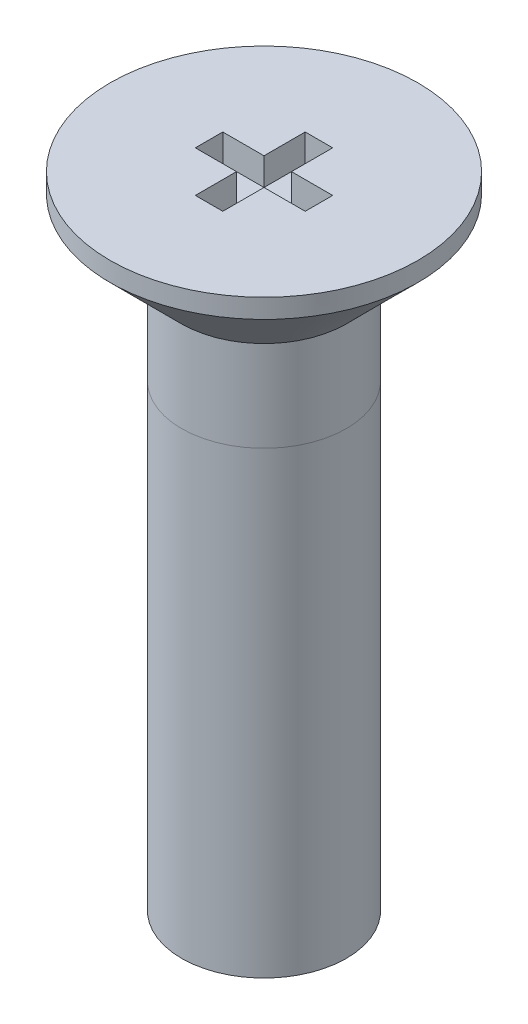
ISO-10303-21;
HEADER;
FILE_DESCRIPTION(('STEP AP214'),'2;1');
FILE_NAME('part.step','',(''),(''),'','','');
FILE_SCHEMA(('AUTOMOTIVE_DESIGN { 1 0 10303 214 1 1 1 1 }'));
ENDSEC;
DATA;
#1=APPLICATION_CONTEXT('core data for automotive mechanical design processes');
#2=APPLICATION_PROTOCOL_DEFINITION('international standard','automotive_design',2000,#1);
#3=PRODUCT_CONTEXT('',#1,'mechanical');
#4=PRODUCT('Part','Part','',(#3));
#5=PRODUCT_RELATED_PRODUCT_CATEGORY('part','',(#4));
#6=PRODUCT_DEFINITION_FORMATION('','',#4);
#7=PRODUCT_DEFINITION_CONTEXT('part definition',#1,'design');
#8=PRODUCT_DEFINITION('design','',#6,#7);
#9=PRODUCT_DEFINITION_SHAPE('','',#8);
#10=(LENGTH_UNIT() NAMED_UNIT(*) SI_UNIT(.MILLI.,.METRE.));
#11=(NAMED_UNIT(*) PLANE_ANGLE_UNIT() SI_UNIT($,.RADIAN.));
#12=(NAMED_UNIT(*) SI_UNIT($,.STERADIAN.) SOLID_ANGLE_UNIT());
#13=UNCERTAINTY_MEASURE_WITH_UNIT(LENGTH_MEASURE(1.E-05),#10,'distance_accuracy_value','');
#14=(GEOMETRIC_REPRESENTATION_CONTEXT(3) GLOBAL_UNCERTAINTY_ASSIGNED_CONTEXT((#13)) GLOBAL_UNIT_ASSIGNED_CONTEXT((#10,
#11,#12)) REPRESENTATION_CONTEXT('',''));
#15=CARTESIAN_POINT('',(0.,0.,0.));
#16=DIRECTION('',(0.,0.,1.));
#17=DIRECTION('',(1.,0.,0.));
#18=AXIS2_PLACEMENT_3D('',#15,#16,#17);
#19=CARTESIAN_POINT('',(0.,11.65,0.));
#20=DIRECTION('',(0.,-1.,0.));
#21=DIRECTION('',(0.,0.,-1.));
#22=AXIS2_PLACEMENT_3D('',#19,#20,#21);
#23=CYLINDRICAL_SURFACE('',#22,2.8);
#24=CARTESIAN_POINT('',(0.,11.65,0.));
#25=DIRECTION('',(0.,1.,0.));
#26=DIRECTION('',(0.,0.,1.));
#27=AXIS2_PLACEMENT_3D('',#24,#25,#26);
#28=CIRCLE('',#27,2.8);
#29=CARTESIAN_POINT('',(0.,11.65,2.8));
#30=VERTEX_POINT('',#29);
#31=EDGE_CURVE('E12',#30,#30,#28,.T.);
#32=ORIENTED_EDGE('',*,*,#31,.F.);
#33=EDGE_LOOP('',(#32));
#34=FACE_BOUND('',#33,.T.);
#35=CARTESIAN_POINT('',(0.,11.3,0.));
#36=DIRECTION('',(0.,-1.,0.));
#37=DIRECTION('',(0.,0.,-1.));
#38=AXIS2_PLACEMENT_3D('',#35,#36,#37);
#39=CIRCLE('',#38,2.8);
#40=CARTESIAN_POINT('',(0.,11.3,-2.8));
#41=VERTEX_POINT('',#40);
#42=EDGE_CURVE('E50',#41,#41,#39,.T.);
#43=ORIENTED_EDGE('',*,*,#42,.F.);
#44=EDGE_LOOP('',(#43));
#45=FACE_BOUND('',#44,.T.);
#46=ADVANCED_FACE('F43',(#34,#45),#23,.T.);
#47=CARTESIAN_POINT('',(0.,11.65,0.));
#48=DIRECTION('',(0.,1.,0.));
#49=DIRECTION('',(0.,0.,1.));
#50=AXIS2_PLACEMENT_3D('',#47,#48,#49);
#51=PLANE('',#50);
#52=DIRECTION('',(0.,0.,1.));
#53=VECTOR('',#52,1.);
#54=CARTESIAN_POINT('',(-0.25,11.65,0.));
#55=LINE('',#54,#53);
#56=CARTESIAN_POINT('',(-0.25,11.65,-1.));
#57=VERTEX_POINT('',#56);
#58=CARTESIAN_POINT('',(-0.25,11.65,-0.25));
#59=VERTEX_POINT('',#58);
#60=EDGE_CURVE('E57',#57,#59,#55,.T.);
#61=ORIENTED_EDGE('',*,*,#60,.F.);
#62=DIRECTION('',(1.,0.,0.));
#63=VECTOR('',#62,1.);
#64=CARTESIAN_POINT('',(0.,11.65,-1.));
#65=LINE('',#64,#63);
#66=CARTESIAN_POINT('',(0.25,11.65,-1.));
#67=VERTEX_POINT('',#66);
#68=EDGE_CURVE('E196',#57,#67,#65,.T.);
#69=ORIENTED_EDGE('',*,*,#68,.T.);
#70=DIRECTION('',(0.,0.,1.));
#71=VECTOR('',#70,1.);
#72=CARTESIAN_POINT('',(0.25,11.65,0.));
#73=LINE('',#72,#71);
#74=CARTESIAN_POINT('',(0.25,11.65,-0.25));
#75=VERTEX_POINT('',#74);
#76=EDGE_CURVE('E194',#67,#75,#73,.T.);
#77=ORIENTED_EDGE('',*,*,#76,.T.);
#78=DIRECTION('',(1.,0.,0.));
#79=VECTOR('',#78,1.);
#80=CARTESIAN_POINT('',(0.,11.65,-0.25));
#81=LINE('',#80,#79);
#82=CARTESIAN_POINT('',(1.,11.65,-0.25));
#83=VERTEX_POINT('',#82);
#84=EDGE_CURVE('E152',#75,#83,#81,.T.);
#85=ORIENTED_EDGE('',*,*,#84,.T.);
#86=DIRECTION('',(0.,0.,1.));
#87=VECTOR('',#86,1.);
#88=CARTESIAN_POINT('',(1.,11.65,0.));
#89=LINE('',#88,#87);
#90=CARTESIAN_POINT('',(1.,11.65,0.25));
#91=VERTEX_POINT('',#90);
#92=EDGE_CURVE('E190',#83,#91,#89,.T.);
#93=ORIENTED_EDGE('',*,*,#92,.T.);
#94=DIRECTION('',(1.,0.,0.));
#95=VECTOR('',#94,1.);
#96=CARTESIAN_POINT('',(0.,11.65,0.25));
#97=LINE('',#96,#95);
#98=CARTESIAN_POINT('',(0.25,11.65,0.25));
#99=VERTEX_POINT('',#98);
#100=EDGE_CURVE('E187',#99,#91,#97,.T.);
#101=ORIENTED_EDGE('',*,*,#100,.F.);
#102=DIRECTION('',(0.,0.,1.));
#103=VECTOR('',#102,1.);
#104=CARTESIAN_POINT('',(0.25,11.65,0.));
#105=LINE('',#104,#103);
#106=CARTESIAN_POINT('',(0.25,11.65,1.));
#107=VERTEX_POINT('',#106);
#108=EDGE_CURVE('E184',#99,#107,#105,.T.);
#109=ORIENTED_EDGE('',*,*,#108,.T.);
#110=DIRECTION('',(1.,0.,0.));
#111=VECTOR('',#110,1.);
#112=CARTESIAN_POINT('',(0.,11.65,1.));
#113=LINE('',#112,#111);
#114=CARTESIAN_POINT('',(-0.25,11.65,1.));
#115=VERTEX_POINT('',#114);
#116=EDGE_CURVE('E181',#115,#107,#113,.T.);
#117=ORIENTED_EDGE('',*,*,#116,.F.);
#118=DIRECTION('',(0.,0.,1.));
#119=VECTOR('',#118,1.);
#120=CARTESIAN_POINT('',(-0.25,11.65,0.));
#121=LINE('',#120,#119);
#122=CARTESIAN_POINT('',(-0.25,11.65,0.25));
#123=VERTEX_POINT('',#122);
#124=EDGE_CURVE('E178',#123,#115,#121,.T.);
#125=ORIENTED_EDGE('',*,*,#124,.F.);
#126=DIRECTION('',(1.,0.,0.));
#127=VECTOR('',#126,1.);
#128=CARTESIAN_POINT('',(0.,11.65,0.25));
#129=LINE('',#128,#127);
#130=CARTESIAN_POINT('',(-1.,11.65,0.25));
#131=VERTEX_POINT('',#130);
#132=EDGE_CURVE('E175',#131,#123,#129,.T.);
#133=ORIENTED_EDGE('',*,*,#132,.F.);
#134=DIRECTION('',(0.,0.,1.));
#135=VECTOR('',#134,1.);
#136=CARTESIAN_POINT('',(-1.,11.65,0.));
#137=LINE('',#136,#135);
#138=CARTESIAN_POINT('',(-1.,11.65,-0.25));
#139=VERTEX_POINT('',#138);
#140=EDGE_CURVE('E172',#139,#131,#137,.T.);
#141=ORIENTED_EDGE('',*,*,#140,.F.);
#142=DIRECTION('',(1.,0.,0.));
#143=VECTOR('',#142,1.);
#144=CARTESIAN_POINT('',(0.,11.65,-0.25));
#145=LINE('',#144,#143);
#146=EDGE_CURVE('E169',#139,#59,#145,.T.);
#147=ORIENTED_EDGE('',*,*,#146,.T.);
#148=EDGE_LOOP('',(#61,#69,#77,#85,#93,#101,#109,#117,#125,#133,#141,#147));
#149=FACE_BOUND('',#148,.T.);
#150=ORIENTED_EDGE('',*,*,#31,.T.);
#151=EDGE_LOOP('',(#150));
#152=FACE_BOUND('',#151,.T.);
#153=ADVANCED_FACE('F227',(#149,#152),#51,.T.);
#154=CARTESIAN_POINT('',(0.,10.,0.));
#155=DIRECTION('',(0.,1.,0.));
#156=DIRECTION('',(0.,0.,1.));
#157=AXIS2_PLACEMENT_3D('',#154,#155,#156);
#158=CONICAL_SURFACE('',#157,1.5,0.785398163397447);
#159=ORIENTED_EDGE('',*,*,#42,.T.);
#160=EDGE_LOOP('',(#159));
#161=FACE_BOUND('',#160,.T.);
#162=CARTESIAN_POINT('',(0.,10.,0.));
#163=DIRECTION('',(0.,-1.,0.));
#164=DIRECTION('',(0.,0.,-1.));
#165=AXIS2_PLACEMENT_3D('',#162,#163,#164);
#166=CIRCLE('',#165,1.5);
#167=CARTESIAN_POINT('',(0.,10.,-1.5));
#168=VERTEX_POINT('',#167);
#169=EDGE_CURVE('E201',#168,#168,#166,.T.);
#170=ORIENTED_EDGE('',*,*,#169,.F.);
#171=EDGE_LOOP('',(#170));
#172=FACE_BOUND('',#171,.T.);
#173=ADVANCED_FACE('F223',(#161,#172),#158,.T.);
#174=CARTESIAN_POINT('',(0.,10.,0.));
#175=DIRECTION('',(0.,1.,0.));
#176=DIRECTION('',(0.,0.,1.));
#177=AXIS2_PLACEMENT_3D('',#174,#175,#176);
#178=PLANE('',#177);
#179=ORIENTED_EDGE('',*,*,#169,.T.);
#180=EDGE_LOOP('',(#179));
#181=FACE_BOUND('',#180,.T.);
#182=ADVANCED_FACE('F239',(#181),#178,.F.);
#183=CARTESIAN_POINT('',(-0.25,11.15,0.));
#184=DIRECTION('',(-1.,0.,0.));
#185=DIRECTION('',(0.,0.,1.));
#186=AXIS2_PLACEMENT_3D('',#183,#184,#185);
#187=PLANE('',#186);
#188=ORIENTED_EDGE('',*,*,#60,.T.);
#189=DIRECTION('',(0.,1.,0.));
#190=VECTOR('',#189,1.);
#191=CARTESIAN_POINT('',(-0.25,11.15,-0.25));
#192=LINE('',#191,#190);
#193=CARTESIAN_POINT('',(-0.25,11.15,-0.25));
#194=VERTEX_POINT('',#193);
#195=EDGE_CURVE('E167',#194,#59,#192,.T.);
#196=ORIENTED_EDGE('',*,*,#195,.F.);
#197=DIRECTION('',(0.,0.,1.));
#198=VECTOR('',#197,1.);
#199=CARTESIAN_POINT('',(-0.25,11.15,0.));
#200=LINE('',#199,#198);
#201=CARTESIAN_POINT('',(-0.25,11.15,-1.));
#202=VERTEX_POINT('',#201);
#203=EDGE_CURVE('E199',#202,#194,#200,.T.);
#204=ORIENTED_EDGE('',*,*,#203,.F.);
#205=DIRECTION('',(0.,1.,0.));
#206=VECTOR('',#205,1.);
#207=CARTESIAN_POINT('',(-0.25,11.15,-1.));
#208=LINE('',#207,#206);
#209=EDGE_CURVE('E65',#202,#57,#208,.T.);
#210=ORIENTED_EDGE('',*,*,#209,.T.);
#211=EDGE_LOOP('',(#188,#196,#204,#210));
#212=FACE_BOUND('',#211,.T.);
#213=ADVANCED_FACE('F243',(#212),#187,.F.);
#214=CARTESIAN_POINT('',(0.,11.15,-1.));
#215=DIRECTION('',(0.,0.,1.));
#216=DIRECTION('',(1.,0.,0.));
#217=AXIS2_PLACEMENT_3D('',#214,#215,#216);
#218=PLANE('',#217);
#219=ORIENTED_EDGE('',*,*,#68,.F.);
#220=ORIENTED_EDGE('',*,*,#209,.F.);
#221=DIRECTION('',(1.,0.,0.));
#222=VECTOR('',#221,1.);
#223=CARTESIAN_POINT('',(0.,11.15,-1.));
#224=LINE('',#223,#222);
#225=CARTESIAN_POINT('',(0.25,11.15,-1.));
#226=VERTEX_POINT('',#225);
#227=EDGE_CURVE('E145',#202,#226,#224,.T.);
#228=ORIENTED_EDGE('',*,*,#227,.T.);
#229=DIRECTION('',(0.,1.,0.));
#230=VECTOR('',#229,1.);
#231=CARTESIAN_POINT('',(0.25,11.15,-1.));
#232=LINE('',#231,#230);
#233=EDGE_CURVE('E142',#226,#67,#232,.T.);
#234=ORIENTED_EDGE('',*,*,#233,.T.);
#235=EDGE_LOOP('',(#219,#220,#228,#234));
#236=FACE_BOUND('',#235,.T.);
#237=ADVANCED_FACE('F248',(#236),#218,.T.);
#238=CARTESIAN_POINT('',(0.25,11.15,0.));
#239=DIRECTION('',(-1.,0.,0.));
#240=DIRECTION('',(0.,0.,1.));
#241=AXIS2_PLACEMENT_3D('',#238,#239,#240);
#242=PLANE('',#241);
#243=ORIENTED_EDGE('',*,*,#76,.F.);
#244=ORIENTED_EDGE('',*,*,#233,.F.);
#245=DIRECTION('',(0.,0.,1.));
#246=VECTOR('',#245,1.);
#247=CARTESIAN_POINT('',(0.25,11.15,0.));
#248=LINE('',#247,#246);
#249=CARTESIAN_POINT('',(0.25,11.15,-0.25));
#250=VERTEX_POINT('',#249);
#251=EDGE_CURVE('E136',#226,#250,#248,.T.);
#252=ORIENTED_EDGE('',*,*,#251,.T.);
#253=DIRECTION('',(0.,1.,0.));
#254=VECTOR('',#253,1.);
#255=CARTESIAN_POINT('',(0.25,11.15,-0.25));
#256=LINE('',#255,#254);
#257=EDGE_CURVE('E140',#250,#75,#256,.T.);
#258=ORIENTED_EDGE('',*,*,#257,.T.);
#259=EDGE_LOOP('',(#243,#244,#252,#258));
#260=FACE_BOUND('',#259,.T.);
#261=ADVANCED_FACE('F139',(#260),#242,.T.);
#262=CARTESIAN_POINT('',(0.,11.15,-0.25));
#263=DIRECTION('',(0.,0.,1.));
#264=DIRECTION('',(1.,0.,0.));
#265=AXIS2_PLACEMENT_3D('',#262,#263,#264);
#266=PLANE('',#265);
#267=ORIENTED_EDGE('',*,*,#84,.F.);
#268=ORIENTED_EDGE('',*,*,#257,.F.);
#269=DIRECTION('',(1.,0.,0.));
#270=VECTOR('',#269,1.);
#271=CARTESIAN_POINT('',(0.,11.15,-0.25));
#272=LINE('',#271,#270);
#273=CARTESIAN_POINT('',(1.,11.15,-0.25));
#274=VERTEX_POINT('',#273);
#275=EDGE_CURVE('E146',#250,#274,#272,.T.);
#276=ORIENTED_EDGE('',*,*,#275,.T.);
#277=DIRECTION('',(0.,1.,0.));
#278=VECTOR('',#277,1.);
#279=CARTESIAN_POINT('',(1.,11.15,-0.25));
#280=LINE('',#279,#278);
#281=EDGE_CURVE('E154',#274,#83,#280,.T.);
#282=ORIENTED_EDGE('',*,*,#281,.T.);
#283=EDGE_LOOP('',(#267,#268,#276,#282));
#284=FACE_BOUND('',#283,.T.);
#285=ADVANCED_FACE('F149',(#284),#266,.T.);
#286=CARTESIAN_POINT('',(1.,11.15,0.));
#287=DIRECTION('',(-1.,0.,0.));
#288=DIRECTION('',(0.,0.,1.));
#289=AXIS2_PLACEMENT_3D('',#286,#287,#288);
#290=PLANE('',#289);
#291=ORIENTED_EDGE('',*,*,#92,.F.);
#292=ORIENTED_EDGE('',*,*,#281,.F.);
#293=DIRECTION('',(0.,0.,1.));
#294=VECTOR('',#293,1.);
#295=CARTESIAN_POINT('',(1.,11.15,0.));
#296=LINE('',#295,#294);
#297=CARTESIAN_POINT('',(1.,11.15,0.25));
#298=VERTEX_POINT('',#297);
#299=EDGE_CURVE('E160',#274,#298,#296,.T.);
#300=ORIENTED_EDGE('',*,*,#299,.T.);
#301=DIRECTION('',(0.,1.,0.));
#302=VECTOR('',#301,1.);
#303=CARTESIAN_POINT('',(1.,11.15,0.25));
#304=LINE('',#303,#302);
#305=EDGE_CURVE('E204',#298,#91,#304,.T.);
#306=ORIENTED_EDGE('',*,*,#305,.T.);
#307=EDGE_LOOP('',(#291,#292,#300,#306));
#308=FACE_BOUND('',#307,.T.);
#309=ADVANCED_FACE('F281',(#308),#290,.T.);
#310=CARTESIAN_POINT('',(0.,11.15,0.25));
#311=DIRECTION('',(0.,0.,1.));
#312=DIRECTION('',(1.,0.,0.));
#313=AXIS2_PLACEMENT_3D('',#310,#311,#312);
#314=PLANE('',#313);
#315=ORIENTED_EDGE('',*,*,#100,.T.);
#316=ORIENTED_EDGE('',*,*,#305,.F.);
#317=DIRECTION('',(1.,0.,0.));
#318=VECTOR('',#317,1.);
#319=CARTESIAN_POINT('',(0.,11.15,0.25));
#320=LINE('',#319,#318);
#321=CARTESIAN_POINT('',(0.25,11.15,0.25));
#322=VERTEX_POINT('',#321);
#323=EDGE_CURVE('E162',#322,#298,#320,.T.);
#324=ORIENTED_EDGE('',*,*,#323,.F.);
#325=DIRECTION('',(0.,1.,0.));
#326=VECTOR('',#325,1.);
#327=CARTESIAN_POINT('',(0.25,11.15,0.25));
#328=LINE('',#327,#326);
#329=EDGE_CURVE('E206',#322,#99,#328,.T.);
#330=ORIENTED_EDGE('',*,*,#329,.T.);
#331=EDGE_LOOP('',(#315,#316,#324,#330));
#332=FACE_BOUND('',#331,.T.);
#333=ADVANCED_FACE('F277',(#332),#314,.F.);
#334=CARTESIAN_POINT('',(0.25,11.15,0.));
#335=DIRECTION('',(-1.,0.,0.));
#336=DIRECTION('',(0.,0.,1.));
#337=AXIS2_PLACEMENT_3D('',#334,#335,#336);
#338=PLANE('',#337);
#339=ORIENTED_EDGE('',*,*,#108,.F.);
#340=ORIENTED_EDGE('',*,*,#329,.F.);
#341=DIRECTION('',(0.,0.,1.));
#342=VECTOR('',#341,1.);
#343=CARTESIAN_POINT('',(0.25,11.15,0.));
#344=LINE('',#343,#342);
#345=CARTESIAN_POINT('',(0.25,11.15,1.));
#346=VERTEX_POINT('',#345);
#347=EDGE_CURVE('E412',#322,#346,#344,.T.);
#348=ORIENTED_EDGE('',*,*,#347,.T.);
#349=DIRECTION('',(0.,1.,0.));
#350=VECTOR('',#349,1.);
#351=CARTESIAN_POINT('',(0.25,11.15,1.));
#352=LINE('',#351,#350);
#353=EDGE_CURVE('E208',#346,#107,#352,.T.);
#354=ORIENTED_EDGE('',*,*,#353,.T.);
#355=EDGE_LOOP('',(#339,#340,#348,#354));
#356=FACE_BOUND('',#355,.T.);
#357=ADVANCED_FACE('F273',(#356),#338,.T.);
#358=CARTESIAN_POINT('',(0.,11.15,1.));
#359=DIRECTION('',(0.,0.,1.));
#360=DIRECTION('',(1.,0.,0.));
#361=AXIS2_PLACEMENT_3D('',#358,#359,#360);
#362=PLANE('',#361);
#363=ORIENTED_EDGE('',*,*,#116,.T.);
#364=ORIENTED_EDGE('',*,*,#353,.F.);
#365=DIRECTION('',(1.,0.,0.));
#366=VECTOR('',#365,1.);
#367=CARTESIAN_POINT('',(0.,11.15,1.));
#368=LINE('',#367,#366);
#369=CARTESIAN_POINT('',(-0.25,11.15,1.));
#370=VERTEX_POINT('',#369);
#371=EDGE_CURVE('E409',#370,#346,#368,.T.);
#372=ORIENTED_EDGE('',*,*,#371,.F.);
#373=DIRECTION('',(0.,1.,0.));
#374=VECTOR('',#373,1.);
#375=CARTESIAN_POINT('',(-0.25,11.15,1.));
#376=LINE('',#375,#374);
#377=EDGE_CURVE('E210',#370,#115,#376,.T.);
#378=ORIENTED_EDGE('',*,*,#377,.T.);
#379=EDGE_LOOP('',(#363,#364,#372,#378));
#380=FACE_BOUND('',#379,.T.);
#381=ADVANCED_FACE('F269',(#380),#362,.F.);
#382=CARTESIAN_POINT('',(-0.25,11.15,0.));
#383=DIRECTION('',(-1.,0.,0.));
#384=DIRECTION('',(0.,0.,1.));
#385=AXIS2_PLACEMENT_3D('',#382,#383,#384);
#386=PLANE('',#385);
#387=ORIENTED_EDGE('',*,*,#124,.T.);
#388=ORIENTED_EDGE('',*,*,#377,.F.);
#389=DIRECTION('',(0.,0.,1.));
#390=VECTOR('',#389,1.);
#391=CARTESIAN_POINT('',(-0.25,11.15,0.));
#392=LINE('',#391,#390);
#393=CARTESIAN_POINT('',(-0.25,11.15,0.25));
#394=VERTEX_POINT('',#393);
#395=EDGE_CURVE('E406',#394,#370,#392,.T.);
#396=ORIENTED_EDGE('',*,*,#395,.F.);
#397=DIRECTION('',(0.,1.,0.));
#398=VECTOR('',#397,1.);
#399=CARTESIAN_POINT('',(-0.25,11.15,0.25));
#400=LINE('',#399,#398);
#401=EDGE_CURVE('E212',#394,#123,#400,.T.);
#402=ORIENTED_EDGE('',*,*,#401,.T.);
#403=EDGE_LOOP('',(#387,#388,#396,#402));
#404=FACE_BOUND('',#403,.T.);
#405=ADVANCED_FACE('F265',(#404),#386,.F.);
#406=CARTESIAN_POINT('',(0.,11.15,0.25));
#407=DIRECTION('',(0.,0.,1.));
#408=DIRECTION('',(1.,0.,0.));
#409=AXIS2_PLACEMENT_3D('',#406,#407,#408);
#410=PLANE('',#409);
#411=ORIENTED_EDGE('',*,*,#132,.T.);
#412=ORIENTED_EDGE('',*,*,#401,.F.);
#413=DIRECTION('',(1.,0.,0.));
#414=VECTOR('',#413,1.);
#415=CARTESIAN_POINT('',(0.,11.15,0.25));
#416=LINE('',#415,#414);
#417=CARTESIAN_POINT('',(-1.,11.15,0.25));
#418=VERTEX_POINT('',#417);
#419=EDGE_CURVE('E403',#418,#394,#416,.T.);
#420=ORIENTED_EDGE('',*,*,#419,.F.);
#421=DIRECTION('',(0.,1.,0.));
#422=VECTOR('',#421,1.);
#423=CARTESIAN_POINT('',(-1.,11.15,0.25));
#424=LINE('',#423,#422);
#425=EDGE_CURVE('E214',#418,#131,#424,.T.);
#426=ORIENTED_EDGE('',*,*,#425,.T.);
#427=EDGE_LOOP('',(#411,#412,#420,#426));
#428=FACE_BOUND('',#427,.T.);
#429=ADVANCED_FACE('F261',(#428),#410,.F.);
#430=CARTESIAN_POINT('',(-1.,11.15,0.));
#431=DIRECTION('',(-1.,0.,0.));
#432=DIRECTION('',(0.,0.,1.));
#433=AXIS2_PLACEMENT_3D('',#430,#431,#432);
#434=PLANE('',#433);
#435=ORIENTED_EDGE('',*,*,#140,.T.);
#436=ORIENTED_EDGE('',*,*,#425,.F.);
#437=DIRECTION('',(0.,0.,1.));
#438=VECTOR('',#437,1.);
#439=CARTESIAN_POINT('',(-1.,11.15,0.));
#440=LINE('',#439,#438);
#441=CARTESIAN_POINT('',(-1.,11.15,-0.25));
#442=VERTEX_POINT('',#441);
#443=EDGE_CURVE('E398',#442,#418,#440,.T.);
#444=ORIENTED_EDGE('',*,*,#443,.F.);
#445=DIRECTION('',(0.,1.,0.));
#446=VECTOR('',#445,1.);
#447=CARTESIAN_POINT('',(-1.,11.15,-0.25));
#448=LINE('',#447,#446);
#449=EDGE_CURVE('E216',#442,#139,#448,.T.);
#450=ORIENTED_EDGE('',*,*,#449,.T.);
#451=EDGE_LOOP('',(#435,#436,#444,#450));
#452=FACE_BOUND('',#451,.T.);
#453=ADVANCED_FACE('F258',(#452),#434,.F.);
#454=CARTESIAN_POINT('',(0.,11.15,-0.25));
#455=DIRECTION('',(0.,0.,1.));
#456=DIRECTION('',(1.,0.,0.));
#457=AXIS2_PLACEMENT_3D('',#454,#455,#456);
#458=PLANE('',#457);
#459=ORIENTED_EDGE('',*,*,#146,.F.);
#460=ORIENTED_EDGE('',*,*,#449,.F.);
#461=DIRECTION('',(1.,0.,0.));
#462=VECTOR('',#461,1.);
#463=CARTESIAN_POINT('',(0.,11.15,-0.25));
#464=LINE('',#463,#462);
#465=EDGE_CURVE('E109',#442,#194,#464,.T.);
#466=ORIENTED_EDGE('',*,*,#465,.T.);
#467=ORIENTED_EDGE('',*,*,#195,.T.);
#468=EDGE_LOOP('',(#459,#460,#466,#467));
#469=FACE_BOUND('',#468,.T.);
#470=ADVANCED_FACE('F255',(#469),#458,.T.);
#471=CARTESIAN_POINT('',(0.,11.15,0.));
#472=DIRECTION('',(0.,1.,0.));
#473=DIRECTION('',(0.,0.,1.));
#474=AXIS2_PLACEMENT_3D('',#471,#472,#473);
#475=PLANE('',#474);
#476=ORIENTED_EDGE('',*,*,#203,.T.);
#477=ORIENTED_EDGE('',*,*,#465,.F.);
#478=ORIENTED_EDGE('',*,*,#443,.T.);
#479=ORIENTED_EDGE('',*,*,#419,.T.);
#480=ORIENTED_EDGE('',*,*,#395,.T.);
#481=ORIENTED_EDGE('',*,*,#371,.T.);
#482=ORIENTED_EDGE('',*,*,#347,.F.);
#483=ORIENTED_EDGE('',*,*,#323,.T.);
#484=ORIENTED_EDGE('',*,*,#299,.F.);
#485=ORIENTED_EDGE('',*,*,#275,.F.);
#486=ORIENTED_EDGE('',*,*,#251,.F.);
#487=ORIENTED_EDGE('',*,*,#227,.F.);
#488=EDGE_LOOP('',(#476,#477,#478,#479,#480,#481,#482,#483,#484,#485,#486,#487));
#489=FACE_BOUND('',#488,.T.);
#490=ADVANCED_FACE('F158',(#489),#475,.T.);
#491=CLOSED_SHELL('',(#46,#153,#173,#182,#213,#237,#261,#285,#309,#333,#357,#381,#405,#429,#453,
#470,#490));
#492=MANIFOLD_SOLID_BREP('B2',#491);
#493=CARTESIAN_POINT('',(0.,10.,0.));
#494=DIRECTION('',(0.,-1.,0.));
#495=DIRECTION('',(0.,0.,-1.));
#496=AXIS2_PLACEMENT_3D('',#493,#494,#495);
#497=CYLINDRICAL_SURFACE('',#496,1.5);
#498=CARTESIAN_POINT('',(0.,10.,0.));
#499=DIRECTION('',(0.,1.,0.));
#500=DIRECTION('',(0.,0.,1.));
#501=AXIS2_PLACEMENT_3D('',#498,#499,#500);
#502=CIRCLE('',#501,1.5);
#503=CARTESIAN_POINT('',(0.,10.,1.5));
#504=VERTEX_POINT('',#503);
#505=EDGE_CURVE('E42',#504,#504,#502,.T.);
#506=ORIENTED_EDGE('',*,*,#505,.F.);
#507=EDGE_LOOP('',(#506));
#508=FACE_BOUND('',#507,.T.);
#509=CARTESIAN_POINT('',(0.,8.35,0.));
#510=DIRECTION('',(0.,1.,0.));
#511=DIRECTION('',(0.,0.,1.));
#512=AXIS2_PLACEMENT_3D('',#509,#510,#511);
#513=CIRCLE('',#512,1.5);
#514=CARTESIAN_POINT('',(0.,8.35,1.5));
#515=VERTEX_POINT('',#514);
#516=EDGE_CURVE('E438',#515,#515,#513,.T.);
#517=ORIENTED_EDGE('',*,*,#516,.T.);
#518=EDGE_LOOP('',(#517));
#519=FACE_BOUND('',#518,.T.);
#520=ADVANCED_FACE('F435',(#508,#519),#497,.T.);
#521=CARTESIAN_POINT('',(0.,10.,0.));
#522=DIRECTION('',(0.,1.,0.));
#523=DIRECTION('',(0.,0.,1.));
#524=AXIS2_PLACEMENT_3D('',#521,#522,#523);
#525=PLANE('',#524);
#526=ORIENTED_EDGE('',*,*,#505,.T.);
#527=EDGE_LOOP('',(#526));
#528=FACE_BOUND('',#527,.T.);
#529=ADVANCED_FACE('F450',(#528),#525,.T.);
#530=CARTESIAN_POINT('',(0.,8.35,0.));
#531=DIRECTION('',(0.,1.,0.));
#532=DIRECTION('',(0.,0.,1.));
#533=AXIS2_PLACEMENT_3D('',#530,#531,#532);
#534=PLANE('',#533);
#535=ORIENTED_EDGE('',*,*,#516,.F.);
#536=EDGE_LOOP('',(#535));
#537=FACE_BOUND('',#536,.T.);
#538=ADVANCED_FACE('F448',(#537),#534,.F.);
#539=CLOSED_SHELL('',(#520,#529,#538));
#540=MANIFOLD_SOLID_BREP('B6',#539);
#541=CARTESIAN_POINT('',(0.,8.35,0.));
#542=DIRECTION('',(0.,-1.,0.));
#543=DIRECTION('',(0.,0.,-1.));
#544=AXIS2_PLACEMENT_3D('',#541,#542,#543);
#545=CYLINDRICAL_SURFACE('',#544,1.5);
#546=CARTESIAN_POINT('',(0.,8.35,0.));
#547=DIRECTION('',(0.,1.,0.));
#548=DIRECTION('',(0.,0.,1.));
#549=AXIS2_PLACEMENT_3D('',#546,#547,#548);
#550=CIRCLE('',#549,1.5);
#551=CARTESIAN_POINT('',(0.,8.35,1.5));
#552=VERTEX_POINT('',#551);
#553=EDGE_CURVE('E434',#552,#552,#550,.T.);
#554=ORIENTED_EDGE('',*,*,#553,.F.);
#555=EDGE_LOOP('',(#554));
#556=FACE_BOUND('',#555,.T.);
#557=CARTESIAN_POINT('',(0.,0.,0.));
#558=DIRECTION('',(0.,1.,0.));
#559=DIRECTION('',(0.,0.,1.));
#560=AXIS2_PLACEMENT_3D('',#557,#558,#559);
#561=CIRCLE('',#560,1.5);
#562=CARTESIAN_POINT('',(0.,0.,1.5));
#563=VERTEX_POINT('',#562);
#564=EDGE_CURVE('E478',#563,#563,#561,.T.);
#565=ORIENTED_EDGE('',*,*,#564,.T.);
#566=EDGE_LOOP('',(#565));
#567=FACE_BOUND('',#566,.T.);
#568=ADVANCED_FACE('F475',(#556,#567),#545,.T.);
#569=CARTESIAN_POINT('',(0.,8.35,0.));
#570=DIRECTION('',(0.,1.,0.));
#571=DIRECTION('',(0.,0.,1.));
#572=AXIS2_PLACEMENT_3D('',#569,#570,#571);
#573=PLANE('',#572);
#574=ORIENTED_EDGE('',*,*,#553,.T.);
#575=EDGE_LOOP('',(#574));
#576=FACE_BOUND('',#575,.T.);
#577=ADVANCED_FACE('F490',(#576),#573,.T.);
#578=CARTESIAN_POINT('',(0.,0.,0.));
#579=DIRECTION('',(0.,1.,0.));
#580=DIRECTION('',(0.,0.,1.));
#581=AXIS2_PLACEMENT_3D('',#578,#579,#580);
#582=PLANE('',#581);
#583=ORIENTED_EDGE('',*,*,#564,.F.);
#584=EDGE_LOOP('',(#583));
#585=FACE_BOUND('',#584,.T.);
#586=ADVANCED_FACE('F488',(#585),#582,.F.);
#587=CLOSED_SHELL('',(#568,#577,#586));
#588=MANIFOLD_SOLID_BREP('B37',#587);
#589=ADVANCED_BREP_SHAPE_REPRESENTATION('',(#18,#492,#540,#588),#14);
#590=SHAPE_DEFINITION_REPRESENTATION(#9,#589);
ENDSEC;
END-ISO-10303-21;
